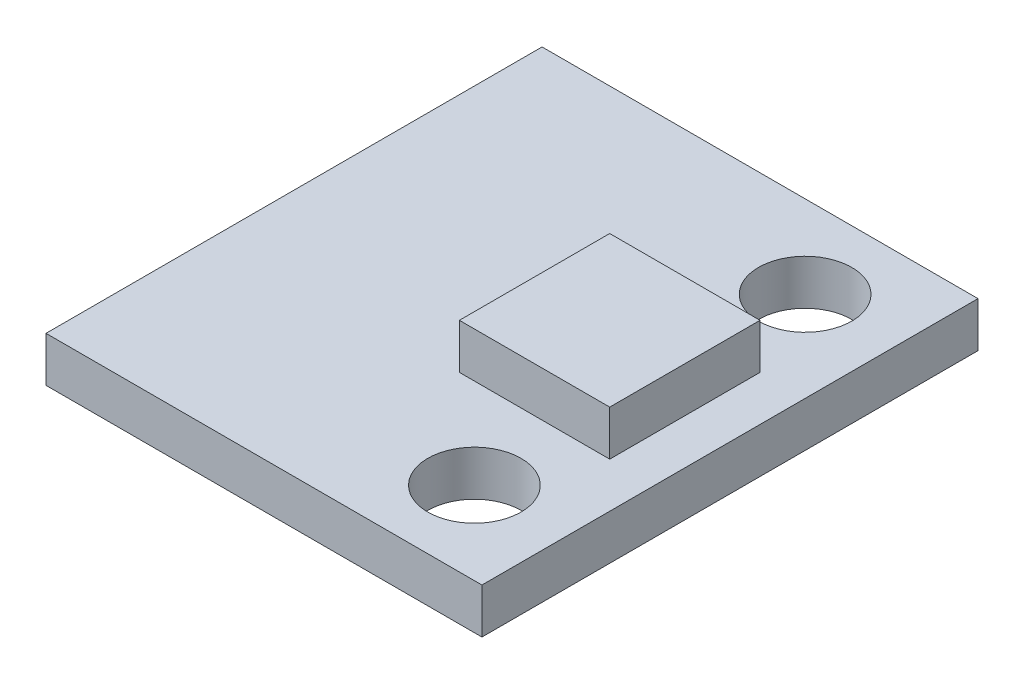
ISO-10303-21;
HEADER;
FILE_DESCRIPTION(('STEP AP214'),'2;1');
FILE_NAME('part.step','',(''),(''),'','','');
FILE_SCHEMA(('AUTOMOTIVE_DESIGN { 1 0 10303 214 1 1 1 1 }'));
ENDSEC;
DATA;
#1=APPLICATION_CONTEXT('core data for automotive mechanical design processes');
#2=APPLICATION_PROTOCOL_DEFINITION('international standard','automotive_design',2000,#1);
#3=PRODUCT_CONTEXT('',#1,'mechanical');
#4=PRODUCT('Part','Part','',(#3));
#5=PRODUCT_RELATED_PRODUCT_CATEGORY('part','',(#4));
#6=PRODUCT_DEFINITION_FORMATION('','',#4);
#7=PRODUCT_DEFINITION_CONTEXT('part definition',#1,'design');
#8=PRODUCT_DEFINITION('design','',#6,#7);
#9=PRODUCT_DEFINITION_SHAPE('','',#8);
#10=(LENGTH_UNIT() NAMED_UNIT(*) SI_UNIT(.MILLI.,.METRE.));
#11=(NAMED_UNIT(*) PLANE_ANGLE_UNIT() SI_UNIT($,.RADIAN.));
#12=(NAMED_UNIT(*) SI_UNIT($,.STERADIAN.) SOLID_ANGLE_UNIT());
#13=UNCERTAINTY_MEASURE_WITH_UNIT(LENGTH_MEASURE(1.E-05),#10,'distance_accuracy_value','');
#14=(GEOMETRIC_REPRESENTATION_CONTEXT(3) GLOBAL_UNCERTAINTY_ASSIGNED_CONTEXT((#13)) GLOBAL_UNIT_ASSIGNED_CONTEXT((#10,
#11,#12)) REPRESENTATION_CONTEXT('',''));
#15=CARTESIAN_POINT('',(0.,0.,0.));
#16=DIRECTION('',(0.,0.,1.));
#17=DIRECTION('',(1.,0.,0.));
#18=AXIS2_PLACEMENT_3D('',#15,#16,#17);
#19=CARTESIAN_POINT('',(0.,1.5,0.));
#20=DIRECTION('',(0.,-1.,0.));
#21=DIRECTION('',(0.,0.,-1.));
#22=AXIS2_PLACEMENT_3D('',#19,#20,#21);
#23=PLANE('',#22);
#24=DIRECTION('',(0.,0.,-1.));
#25=VECTOR('',#24,1.);
#26=CARTESIAN_POINT('',(7.25,1.5,8.25));
#27=LINE('',#26,#25);
#28=CARTESIAN_POINT('',(7.25,1.5,8.25));
#29=VERTEX_POINT('',#28);
#30=CARTESIAN_POINT('',(7.25,1.5,-8.25));
#31=VERTEX_POINT('',#30);
#32=EDGE_CURVE('E136',#29,#31,#27,.T.);
#33=ORIENTED_EDGE('',*,*,#32,.T.);
#34=DIRECTION('',(-1.,0.,0.));
#35=VECTOR('',#34,1.);
#36=CARTESIAN_POINT('',(-7.25,1.5,-8.25));
#37=LINE('',#36,#35);
#38=CARTESIAN_POINT('',(-7.25,1.5,-8.25));
#39=VERTEX_POINT('',#38);
#40=EDGE_CURVE('E139',#31,#39,#37,.T.);
#41=ORIENTED_EDGE('',*,*,#40,.T.);
#42=DIRECTION('',(0.,0.,1.));
#43=VECTOR('',#42,1.);
#44=CARTESIAN_POINT('',(-7.25,1.5,8.25));
#45=LINE('',#44,#43);
#46=CARTESIAN_POINT('',(-7.25,1.5,8.25));
#47=VERTEX_POINT('',#46);
#48=EDGE_CURVE('E142',#39,#47,#45,.T.);
#49=ORIENTED_EDGE('',*,*,#48,.T.);
#50=DIRECTION('',(1.,0.,0.));
#51=VECTOR('',#50,1.);
#52=CARTESIAN_POINT('',(-7.25,1.5,8.25));
#53=LINE('',#52,#51);
#54=EDGE_CURVE('E144',#47,#29,#53,.T.);
#55=ORIENTED_EDGE('',*,*,#54,.T.);
#56=EDGE_LOOP('',(#33,#41,#49,#55));
#57=FACE_BOUND('',#56,.T.);
#58=CARTESIAN_POINT('',(4.25,1.5,5.5));
#59=DIRECTION('',(0.,1.,0.));
#60=DIRECTION('',(0.,0.,-1.));
#61=AXIS2_PLACEMENT_3D('',#58,#59,#60);
#62=CIRCLE('',#61,1.55);
#63=CARTESIAN_POINT('',(4.25,1.5,3.95));
#64=VERTEX_POINT('',#63);
#65=EDGE_CURVE('E118',#64,#64,#62,.T.);
#66=ORIENTED_EDGE('',*,*,#65,.F.);
#67=EDGE_LOOP('',(#66));
#68=FACE_BOUND('',#67,.T.);
#69=CARTESIAN_POINT('',(4.25,1.5,-5.5));
#70=DIRECTION('',(0.,1.,0.));
#71=DIRECTION('',(0.,0.,1.));
#72=AXIS2_PLACEMENT_3D('',#69,#70,#71);
#73=CIRCLE('',#72,1.55);
#74=CARTESIAN_POINT('',(4.25,1.5,-3.95));
#75=VERTEX_POINT('',#74);
#76=EDGE_CURVE('E131',#75,#75,#73,.T.);
#77=ORIENTED_EDGE('',*,*,#76,.F.);
#78=EDGE_LOOP('',(#77));
#79=FACE_BOUND('',#78,.T.);
#80=DIRECTION('',(0.,0.,-1.));
#81=VECTOR('',#80,1.);
#82=CARTESIAN_POINT('',(5.75,1.5,2.5));
#83=LINE('',#82,#81);
#84=CARTESIAN_POINT('',(5.75,1.5,2.5));
#85=VERTEX_POINT('',#84);
#86=CARTESIAN_POINT('',(5.75,1.5,-2.5));
#87=VERTEX_POINT('',#86);
#88=EDGE_CURVE('E117',#85,#87,#83,.T.);
#89=ORIENTED_EDGE('',*,*,#88,.F.);
#90=DIRECTION('',(1.,0.,0.));
#91=VECTOR('',#90,1.);
#92=CARTESIAN_POINT('',(0.750000000000001,1.5,2.5));
#93=LINE('',#92,#91);
#94=CARTESIAN_POINT('',(0.750000000000001,1.5,2.5));
#95=VERTEX_POINT('',#94);
#96=EDGE_CURVE('E114',#95,#85,#93,.T.);
#97=ORIENTED_EDGE('',*,*,#96,.F.);
#98=DIRECTION('',(0.,0.,1.));
#99=VECTOR('',#98,1.);
#100=CARTESIAN_POINT('',(0.750000000000001,1.5,2.5));
#101=LINE('',#100,#99);
#102=CARTESIAN_POINT('',(0.750000000000001,1.5,-2.5));
#103=VERTEX_POINT('',#102);
#104=EDGE_CURVE('E52',#103,#95,#101,.T.);
#105=ORIENTED_EDGE('',*,*,#104,.F.);
#106=DIRECTION('',(-1.,0.,0.));
#107=VECTOR('',#106,1.);
#108=CARTESIAN_POINT('',(0.750000000000001,1.5,-2.5));
#109=LINE('',#108,#107);
#110=EDGE_CURVE('E47',#87,#103,#109,.T.);
#111=ORIENTED_EDGE('',*,*,#110,.F.);
#112=EDGE_LOOP('',(#89,#97,#105,#111));
#113=FACE_BOUND('',#112,.T.);
#114=ADVANCED_FACE('F32',(#57,#68,#79,#113),#23,.F.);
#115=CARTESIAN_POINT('',(7.25,1.5,8.25));
#116=DIRECTION('',(-1.,0.,0.));
#117=DIRECTION('',(0.,0.,1.));
#118=AXIS2_PLACEMENT_3D('',#115,#116,#117);
#119=PLANE('',#118);
#120=DIRECTION('',(0.,0.,-1.));
#121=VECTOR('',#120,1.);
#122=CARTESIAN_POINT('',(7.25,0.,8.25));
#123=LINE('',#122,#121);
#124=CARTESIAN_POINT('',(7.25,0.,8.25));
#125=VERTEX_POINT('',#124);
#126=CARTESIAN_POINT('',(7.25,0.,-8.25));
#127=VERTEX_POINT('',#126);
#128=EDGE_CURVE('E130',#125,#127,#123,.T.);
#129=ORIENTED_EDGE('',*,*,#128,.T.);
#130=DIRECTION('',(0.,-1.,0.));
#131=VECTOR('',#130,1.);
#132=CARTESIAN_POINT('',(7.25,1.5,-8.25));
#133=LINE('',#132,#131);
#134=EDGE_CURVE('E11',#31,#127,#133,.T.);
#135=ORIENTED_EDGE('',*,*,#134,.F.);
#136=ORIENTED_EDGE('',*,*,#32,.F.);
#137=DIRECTION('',(0.,-1.,0.));
#138=VECTOR('',#137,1.);
#139=CARTESIAN_POINT('',(7.25,1.5,8.25));
#140=LINE('',#139,#138);
#141=EDGE_CURVE('E146',#29,#125,#140,.T.);
#142=ORIENTED_EDGE('',*,*,#141,.T.);
#143=EDGE_LOOP('',(#129,#135,#136,#142));
#144=FACE_BOUND('',#143,.T.);
#145=ADVANCED_FACE('F34',(#144),#119,.F.);
#146=CARTESIAN_POINT('',(-7.25,1.5,-8.25));
#147=DIRECTION('',(0.,0.,1.));
#148=DIRECTION('',(1.,0.,0.));
#149=AXIS2_PLACEMENT_3D('',#146,#147,#148);
#150=PLANE('',#149);
#151=DIRECTION('',(-1.,0.,0.));
#152=VECTOR('',#151,1.);
#153=CARTESIAN_POINT('',(-7.25,0.,-8.25));
#154=LINE('',#153,#152);
#155=CARTESIAN_POINT('',(-7.25,0.,-8.25));
#156=VERTEX_POINT('',#155);
#157=EDGE_CURVE('E149',#127,#156,#154,.T.);
#158=ORIENTED_EDGE('',*,*,#157,.T.);
#159=DIRECTION('',(0.,-1.,0.));
#160=VECTOR('',#159,1.);
#161=CARTESIAN_POINT('',(-7.25,1.5,-8.25));
#162=LINE('',#161,#160);
#163=EDGE_CURVE('E40',#39,#156,#162,.T.);
#164=ORIENTED_EDGE('',*,*,#163,.F.);
#165=ORIENTED_EDGE('',*,*,#40,.F.);
#166=ORIENTED_EDGE('',*,*,#134,.T.);
#167=EDGE_LOOP('',(#158,#164,#165,#166));
#168=FACE_BOUND('',#167,.T.);
#169=ADVANCED_FACE('F179',(#168),#150,.F.);
#170=CARTESIAN_POINT('',(-7.25,1.5,8.25));
#171=DIRECTION('',(1.,0.,0.));
#172=DIRECTION('',(0.,0.,-1.));
#173=AXIS2_PLACEMENT_3D('',#170,#171,#172);
#174=PLANE('',#173);
#175=DIRECTION('',(0.,0.,1.));
#176=VECTOR('',#175,1.);
#177=CARTESIAN_POINT('',(-7.25,0.,8.25));
#178=LINE('',#177,#176);
#179=CARTESIAN_POINT('',(-7.25,0.,8.25));
#180=VERTEX_POINT('',#179);
#181=EDGE_CURVE('E151',#156,#180,#178,.T.);
#182=ORIENTED_EDGE('',*,*,#181,.T.);
#183=DIRECTION('',(0.,-1.,0.));
#184=VECTOR('',#183,1.);
#185=CARTESIAN_POINT('',(-7.25,1.5,8.25));
#186=LINE('',#185,#184);
#187=EDGE_CURVE('E156',#47,#180,#186,.T.);
#188=ORIENTED_EDGE('',*,*,#187,.F.);
#189=ORIENTED_EDGE('',*,*,#48,.F.);
#190=ORIENTED_EDGE('',*,*,#163,.T.);
#191=EDGE_LOOP('',(#182,#188,#189,#190));
#192=FACE_BOUND('',#191,.T.);
#193=ADVANCED_FACE('F163',(#192),#174,.F.);
#194=CARTESIAN_POINT('',(-7.25,1.5,8.25));
#195=DIRECTION('',(0.,0.,-1.));
#196=DIRECTION('',(-1.,0.,0.));
#197=AXIS2_PLACEMENT_3D('',#194,#195,#196);
#198=PLANE('',#197);
#199=DIRECTION('',(1.,0.,0.));
#200=VECTOR('',#199,1.);
#201=CARTESIAN_POINT('',(-7.25,0.,8.25));
#202=LINE('',#201,#200);
#203=EDGE_CURVE('E140',#180,#125,#202,.T.);
#204=ORIENTED_EDGE('',*,*,#203,.T.);
#205=ORIENTED_EDGE('',*,*,#141,.F.);
#206=ORIENTED_EDGE('',*,*,#54,.F.);
#207=ORIENTED_EDGE('',*,*,#187,.T.);
#208=EDGE_LOOP('',(#204,#205,#206,#207));
#209=FACE_BOUND('',#208,.T.);
#210=ADVANCED_FACE('F172',(#209),#198,.F.);
#211=CARTESIAN_POINT('',(0.,0.,0.));
#212=DIRECTION('',(0.,-1.,0.));
#213=DIRECTION('',(0.,0.,-1.));
#214=AXIS2_PLACEMENT_3D('',#211,#212,#213);
#215=PLANE('',#214);
#216=CARTESIAN_POINT('',(4.25,0.,-5.5));
#217=DIRECTION('',(0.,1.,0.));
#218=DIRECTION('',(0.,0.,1.));
#219=AXIS2_PLACEMENT_3D('',#216,#217,#218);
#220=CIRCLE('',#219,1.55);
#221=CARTESIAN_POINT('',(4.25,0.,-3.95));
#222=VERTEX_POINT('',#221);
#223=EDGE_CURVE('E127',#222,#222,#220,.T.);
#224=ORIENTED_EDGE('',*,*,#223,.T.);
#225=EDGE_LOOP('',(#224));
#226=FACE_BOUND('',#225,.T.);
#227=CARTESIAN_POINT('',(4.25,0.,5.5));
#228=DIRECTION('',(0.,1.,0.));
#229=DIRECTION('',(0.,0.,-1.));
#230=AXIS2_PLACEMENT_3D('',#227,#228,#229);
#231=CIRCLE('',#230,1.55);
#232=CARTESIAN_POINT('',(4.25,0.,3.95));
#233=VERTEX_POINT('',#232);
#234=EDGE_CURVE('E121',#233,#233,#231,.T.);
#235=ORIENTED_EDGE('',*,*,#234,.T.);
#236=EDGE_LOOP('',(#235));
#237=FACE_BOUND('',#236,.T.);
#238=ORIENTED_EDGE('',*,*,#128,.F.);
#239=ORIENTED_EDGE('',*,*,#203,.F.);
#240=ORIENTED_EDGE('',*,*,#181,.F.);
#241=ORIENTED_EDGE('',*,*,#157,.F.);
#242=EDGE_LOOP('',(#238,#239,#240,#241));
#243=FACE_BOUND('',#242,.T.);
#244=ADVANCED_FACE('F169',(#226,#237,#243),#215,.T.);
#245=CARTESIAN_POINT('',(4.25,0.,5.5));
#246=DIRECTION('',(0.,1.,0.));
#247=DIRECTION('',(0.,0.,1.));
#248=AXIS2_PLACEMENT_3D('',#245,#246,#247);
#249=CYLINDRICAL_SURFACE('',#248,1.55);
#250=ORIENTED_EDGE('',*,*,#234,.F.);
#251=EDGE_LOOP('',(#250));
#252=FACE_BOUND('',#251,.T.);
#253=ORIENTED_EDGE('',*,*,#65,.T.);
#254=EDGE_LOOP('',(#253));
#255=FACE_BOUND('',#254,.T.);
#256=ADVANCED_FACE('F192',(#252,#255),#249,.F.);
#257=CARTESIAN_POINT('',(4.25,0.,-5.5));
#258=DIRECTION('',(0.,1.,0.));
#259=DIRECTION('',(0.,0.,1.));
#260=AXIS2_PLACEMENT_3D('',#257,#258,#259);
#261=CYLINDRICAL_SURFACE('',#260,1.55);
#262=ORIENTED_EDGE('',*,*,#223,.F.);
#263=EDGE_LOOP('',(#262));
#264=FACE_BOUND('',#263,.T.);
#265=ORIENTED_EDGE('',*,*,#76,.T.);
#266=EDGE_LOOP('',(#265));
#267=FACE_BOUND('',#266,.T.);
#268=ADVANCED_FACE('F212',(#264,#267),#261,.F.);
#269=CARTESIAN_POINT('',(5.75,3.,2.5));
#270=DIRECTION('',(-1.,0.,0.));
#271=DIRECTION('',(0.,0.,1.));
#272=AXIS2_PLACEMENT_3D('',#269,#270,#271);
#273=PLANE('',#272);
#274=ORIENTED_EDGE('',*,*,#88,.T.);
#275=DIRECTION('',(0.,-1.,0.));
#276=VECTOR('',#275,1.);
#277=CARTESIAN_POINT('',(5.75,3.,-2.5));
#278=LINE('',#277,#276);
#279=CARTESIAN_POINT('',(5.75,3.,-2.5));
#280=VERTEX_POINT('',#279);
#281=EDGE_CURVE('E98',#280,#87,#278,.T.);
#282=ORIENTED_EDGE('',*,*,#281,.F.);
#283=DIRECTION('',(0.,0.,-1.));
#284=VECTOR('',#283,1.);
#285=CARTESIAN_POINT('',(5.75,3.,2.5));
#286=LINE('',#285,#284);
#287=CARTESIAN_POINT('',(5.75,3.,2.5));
#288=VERTEX_POINT('',#287);
#289=EDGE_CURVE('E105',#288,#280,#286,.T.);
#290=ORIENTED_EDGE('',*,*,#289,.F.);
#291=DIRECTION('',(0.,-1.,0.));
#292=VECTOR('',#291,1.);
#293=CARTESIAN_POINT('',(5.75,3.,2.5));
#294=LINE('',#293,#292);
#295=EDGE_CURVE('E293',#288,#85,#294,.T.);
#296=ORIENTED_EDGE('',*,*,#295,.T.);
#297=EDGE_LOOP('',(#274,#282,#290,#296));
#298=FACE_BOUND('',#297,.T.);
#299=ADVANCED_FACE('F116',(#298),#273,.F.);
#300=CARTESIAN_POINT('',(0.750000000000001,3.,-2.5));
#301=DIRECTION('',(0.,0.,1.));
#302=DIRECTION('',(1.,0.,0.));
#303=AXIS2_PLACEMENT_3D('',#300,#301,#302);
#304=PLANE('',#303);
#305=ORIENTED_EDGE('',*,*,#110,.T.);
#306=DIRECTION('',(0.,-1.,0.));
#307=VECTOR('',#306,1.);
#308=CARTESIAN_POINT('',(0.750000000000001,3.,-2.5));
#309=LINE('',#308,#307);
#310=CARTESIAN_POINT('',(0.750000000000001,3.,-2.5));
#311=VERTEX_POINT('',#310);
#312=EDGE_CURVE('E101',#311,#103,#309,.T.);
#313=ORIENTED_EDGE('',*,*,#312,.F.);
#314=DIRECTION('',(-1.,0.,0.));
#315=VECTOR('',#314,1.);
#316=CARTESIAN_POINT('',(0.750000000000001,3.,-2.5));
#317=LINE('',#316,#315);
#318=EDGE_CURVE('E94',#280,#311,#317,.T.);
#319=ORIENTED_EDGE('',*,*,#318,.F.);
#320=ORIENTED_EDGE('',*,*,#281,.T.);
#321=EDGE_LOOP('',(#305,#313,#319,#320));
#322=FACE_BOUND('',#321,.T.);
#323=ADVANCED_FACE('F96',(#322),#304,.F.);
#324=CARTESIAN_POINT('',(0.750000000000001,3.,2.5));
#325=DIRECTION('',(1.,0.,0.));
#326=DIRECTION('',(0.,0.,-1.));
#327=AXIS2_PLACEMENT_3D('',#324,#325,#326);
#328=PLANE('',#327);
#329=ORIENTED_EDGE('',*,*,#104,.T.);
#330=DIRECTION('',(0.,-1.,0.));
#331=VECTOR('',#330,1.);
#332=CARTESIAN_POINT('',(0.750000000000001,3.,2.5));
#333=LINE('',#332,#331);
#334=CARTESIAN_POINT('',(0.750000000000001,3.,2.5));
#335=VERTEX_POINT('',#334);
#336=EDGE_CURVE('E123',#335,#95,#333,.T.);
#337=ORIENTED_EDGE('',*,*,#336,.F.);
#338=DIRECTION('',(0.,0.,1.));
#339=VECTOR('',#338,1.);
#340=CARTESIAN_POINT('',(0.750000000000001,3.,2.5));
#341=LINE('',#340,#339);
#342=EDGE_CURVE('E104',#311,#335,#341,.T.);
#343=ORIENTED_EDGE('',*,*,#342,.F.);
#344=ORIENTED_EDGE('',*,*,#312,.T.);
#345=EDGE_LOOP('',(#329,#337,#343,#344));
#346=FACE_BOUND('',#345,.T.);
#347=ADVANCED_FACE('F231',(#346),#328,.F.);
#348=CARTESIAN_POINT('',(0.750000000000001,3.,2.5));
#349=DIRECTION('',(0.,0.,-1.));
#350=DIRECTION('',(-1.,0.,0.));
#351=AXIS2_PLACEMENT_3D('',#348,#349,#350);
#352=PLANE('',#351);
#353=ORIENTED_EDGE('',*,*,#96,.T.);
#354=ORIENTED_EDGE('',*,*,#295,.F.);
#355=DIRECTION('',(1.,0.,0.));
#356=VECTOR('',#355,1.);
#357=CARTESIAN_POINT('',(0.750000000000001,3.,2.5));
#358=LINE('',#357,#356);
#359=EDGE_CURVE('E110',#335,#288,#358,.T.);
#360=ORIENTED_EDGE('',*,*,#359,.F.);
#361=ORIENTED_EDGE('',*,*,#336,.T.);
#362=EDGE_LOOP('',(#353,#354,#360,#361));
#363=FACE_BOUND('',#362,.T.);
#364=ADVANCED_FACE('F238',(#363),#352,.F.);
#365=CARTESIAN_POINT('',(0.,3.,0.));
#366=DIRECTION('',(0.,-1.,0.));
#367=DIRECTION('',(0.,0.,-1.));
#368=AXIS2_PLACEMENT_3D('',#365,#366,#367);
#369=PLANE('',#368);
#370=ORIENTED_EDGE('',*,*,#289,.T.);
#371=ORIENTED_EDGE('',*,*,#318,.T.);
#372=ORIENTED_EDGE('',*,*,#342,.T.);
#373=ORIENTED_EDGE('',*,*,#359,.T.);
#374=EDGE_LOOP('',(#370,#371,#372,#373));
#375=FACE_BOUND('',#374,.T.);
#376=ADVANCED_FACE('F108',(#375),#369,.F.);
#377=CLOSED_SHELL('',(#114,#145,#169,#193,#210,#244,#256,#268,#299,#323,#347,#364,#376));
#378=MANIFOLD_SOLID_BREP('B2',#377);
#379=ADVANCED_BREP_SHAPE_REPRESENTATION('',(#18,#378),#14);
#380=SHAPE_DEFINITION_REPRESENTATION(#9,#379);
ENDSEC;
END-ISO-10303-21;
